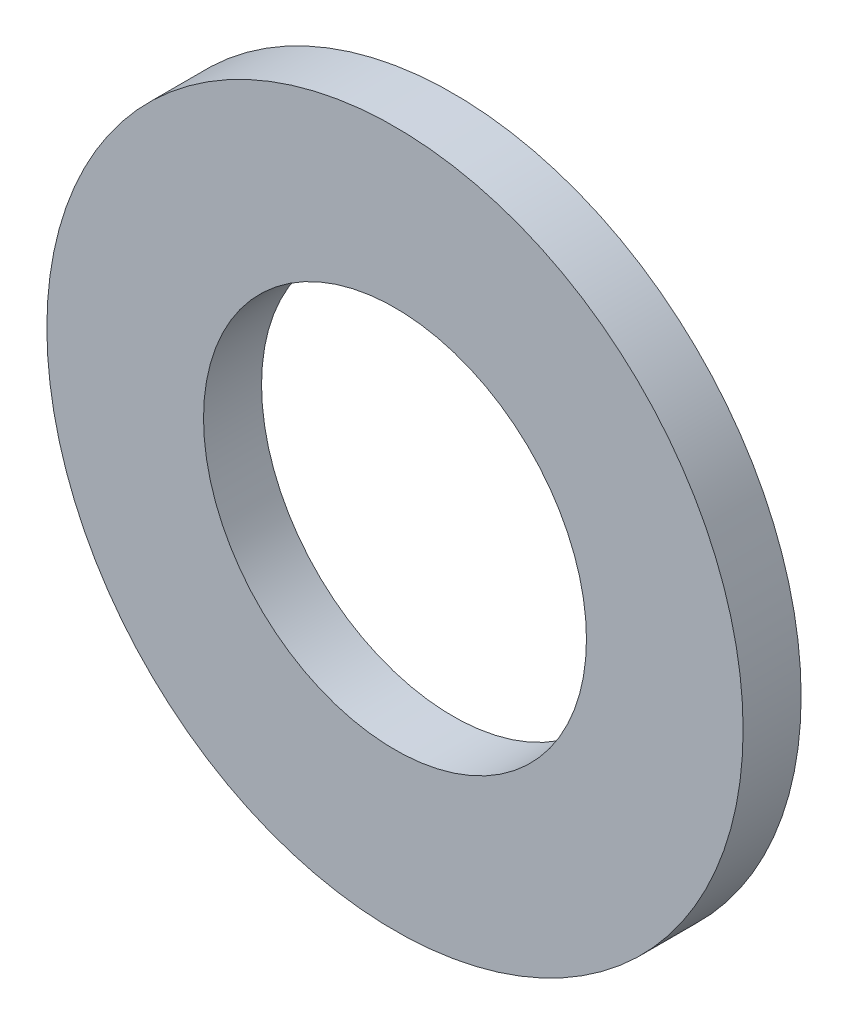
ISO-10303-21;
HEADER;
FILE_DESCRIPTION(('STEP AP214'),'2;1');
FILE_NAME('part.step','',(''),(''),'','','');
FILE_SCHEMA(('AUTOMOTIVE_DESIGN { 1 0 10303 214 1 1 1 1 }'));
ENDSEC;
DATA;
#1=APPLICATION_CONTEXT('core data for automotive mechanical design processes');
#2=APPLICATION_PROTOCOL_DEFINITION('international standard','automotive_design',2000,#1);
#3=PRODUCT_CONTEXT('',#1,'mechanical');
#4=PRODUCT('Part','Part','',(#3));
#5=PRODUCT_RELATED_PRODUCT_CATEGORY('part','',(#4));
#6=PRODUCT_DEFINITION_FORMATION('','',#4);
#7=PRODUCT_DEFINITION_CONTEXT('part definition',#1,'design');
#8=PRODUCT_DEFINITION('design','',#6,#7);
#9=PRODUCT_DEFINITION_SHAPE('','',#8);
#10=(LENGTH_UNIT() NAMED_UNIT(*) SI_UNIT(.MILLI.,.METRE.));
#11=(NAMED_UNIT(*) PLANE_ANGLE_UNIT() SI_UNIT($,.RADIAN.));
#12=(NAMED_UNIT(*) SI_UNIT($,.STERADIAN.) SOLID_ANGLE_UNIT());
#13=UNCERTAINTY_MEASURE_WITH_UNIT(LENGTH_MEASURE(1.E-05),#10,'distance_accuracy_value','');
#14=(GEOMETRIC_REPRESENTATION_CONTEXT(3) GLOBAL_UNCERTAINTY_ASSIGNED_CONTEXT((#13)) GLOBAL_UNIT_ASSIGNED_CONTEXT((#10,
#11,#12)) REPRESENTATION_CONTEXT('',''));
#15=CARTESIAN_POINT('',(0.,0.,0.));
#16=DIRECTION('',(0.,0.,1.));
#17=DIRECTION('',(1.,0.,0.));
#18=AXIS2_PLACEMENT_3D('',#15,#16,#17);
#19=CARTESIAN_POINT('',(0.,0.,0.79375));
#20=DIRECTION('',(0.,0.,1.));
#21=DIRECTION('',(1.,0.,0.));
#22=AXIS2_PLACEMENT_3D('',#19,#20,#21);
#23=PLANE('',#22);
#24=CARTESIAN_POINT('',(0.,0.,0.79375));
#25=DIRECTION('',(0.,0.,1.));
#26=DIRECTION('',(1.,0.,0.));
#27=AXIS2_PLACEMENT_3D('',#24,#25,#26);
#28=CIRCLE('',#27,9.525);
#29=CARTESIAN_POINT('',(9.525,0.,0.79375));
#30=VERTEX_POINT('',#29);
#31=EDGE_CURVE('E10',#30,#30,#28,.T.);
#32=ORIENTED_EDGE('',*,*,#31,.T.);
#33=EDGE_LOOP('',(#32));
#34=FACE_BOUND('',#33,.T.);
#35=CARTESIAN_POINT('',(0.,0.,0.79375));
#36=DIRECTION('',(0.,0.,1.));
#37=DIRECTION('',(1.,0.,0.));
#38=AXIS2_PLACEMENT_3D('',#35,#36,#37);
#39=CIRCLE('',#38,5.23875);
#40=CARTESIAN_POINT('',(5.23875,0.,0.79375));
#41=VERTEX_POINT('',#40);
#42=EDGE_CURVE('E49',#41,#41,#39,.T.);
#43=ORIENTED_EDGE('',*,*,#42,.F.);
#44=EDGE_LOOP('',(#43));
#45=FACE_BOUND('',#44,.T.);
#46=ADVANCED_FACE('F38',(#34,#45),#23,.T.);
#47=CARTESIAN_POINT('',(0.,0.,-0.79375));
#48=DIRECTION('',(0.,0.,1.));
#49=DIRECTION('',(1.,0.,0.));
#50=AXIS2_PLACEMENT_3D('',#47,#48,#49);
#51=PLANE('',#50);
#52=CARTESIAN_POINT('',(0.,0.,-0.79375));
#53=DIRECTION('',(0.,0.,1.));
#54=DIRECTION('',(1.,0.,0.));
#55=AXIS2_PLACEMENT_3D('',#52,#53,#54);
#56=CIRCLE('',#55,9.525);
#57=CARTESIAN_POINT('',(9.525,0.,-0.79375));
#58=VERTEX_POINT('',#57);
#59=EDGE_CURVE('E42',#58,#58,#56,.T.);
#60=ORIENTED_EDGE('',*,*,#59,.F.);
#61=EDGE_LOOP('',(#60));
#62=FACE_BOUND('',#61,.T.);
#63=CARTESIAN_POINT('',(0.,0.,-0.79375));
#64=DIRECTION('',(0.,0.,1.));
#65=DIRECTION('',(1.,0.,0.));
#66=AXIS2_PLACEMENT_3D('',#63,#64,#65);
#67=CIRCLE('',#66,5.23875);
#68=CARTESIAN_POINT('',(5.23875,0.,-0.79375));
#69=VERTEX_POINT('',#68);
#70=EDGE_CURVE('E51',#69,#69,#67,.T.);
#71=ORIENTED_EDGE('',*,*,#70,.T.);
#72=EDGE_LOOP('',(#71));
#73=FACE_BOUND('',#72,.T.);
#74=ADVANCED_FACE('F61',(#62,#73),#51,.F.);
#75=CARTESIAN_POINT('',(0.,0.,0.79375));
#76=DIRECTION('',(0.,0.,-1.));
#77=DIRECTION('',(-1.,0.,0.));
#78=AXIS2_PLACEMENT_3D('',#75,#76,#77);
#79=CYLINDRICAL_SURFACE('',#78,9.525);
#80=ORIENTED_EDGE('',*,*,#31,.F.);
#81=EDGE_LOOP('',(#80));
#82=FACE_BOUND('',#81,.T.);
#83=ORIENTED_EDGE('',*,*,#59,.T.);
#84=EDGE_LOOP('',(#83));
#85=FACE_BOUND('',#84,.T.);
#86=ADVANCED_FACE('F40',(#82,#85),#79,.T.);
#87=CARTESIAN_POINT('',(0.,0.,0.79375));
#88=DIRECTION('',(0.,0.,-1.));
#89=DIRECTION('',(-1.,0.,0.));
#90=AXIS2_PLACEMENT_3D('',#87,#88,#89);
#91=CYLINDRICAL_SURFACE('',#90,5.23875);
#92=ORIENTED_EDGE('',*,*,#42,.T.);
#93=EDGE_LOOP('',(#92));
#94=FACE_BOUND('',#93,.T.);
#95=ORIENTED_EDGE('',*,*,#70,.F.);
#96=EDGE_LOOP('',(#95));
#97=FACE_BOUND('',#96,.T.);
#98=ADVANCED_FACE('F57',(#94,#97),#91,.F.);
#99=CLOSED_SHELL('',(#46,#74,#86,#98));
#100=MANIFOLD_SOLID_BREP('B2',#99);
#101=ADVANCED_BREP_SHAPE_REPRESENTATION('',(#18,#100),#14);
#102=SHAPE_DEFINITION_REPRESENTATION(#9,#101);
ENDSEC;
END-ISO-10303-21;
